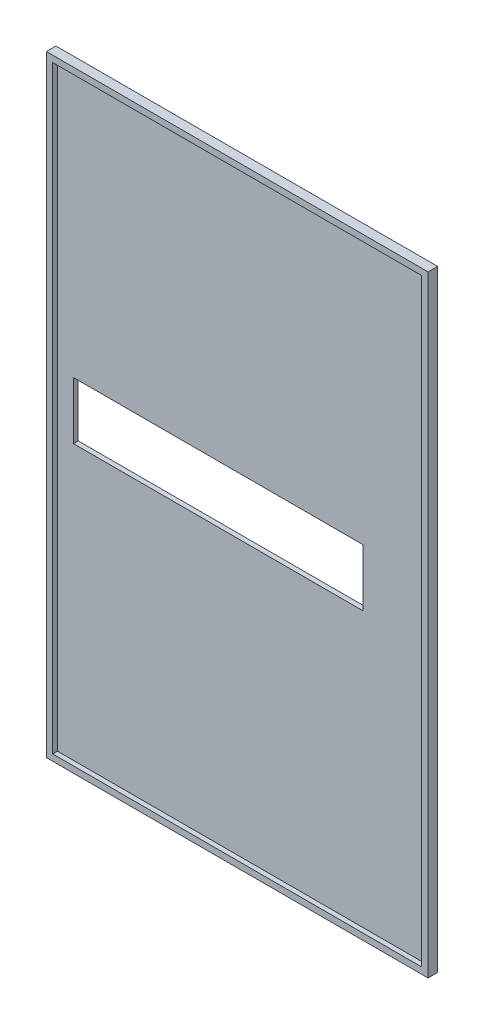
ISO-10303-21;
HEADER;
FILE_DESCRIPTION(('STEP AP214'),'2;1');
FILE_NAME('part.step','',(''),(''),'','','');
FILE_SCHEMA(('AUTOMOTIVE_DESIGN { 1 0 10303 214 1 1 1 1 }'));
ENDSEC;
DATA;
#1=APPLICATION_CONTEXT('core data for automotive mechanical design processes');
#2=APPLICATION_PROTOCOL_DEFINITION('international standard','automotive_design',2000,#1);
#3=PRODUCT_CONTEXT('',#1,'mechanical');
#4=PRODUCT('Part','Part','',(#3));
#5=PRODUCT_RELATED_PRODUCT_CATEGORY('part','',(#4));
#6=PRODUCT_DEFINITION_FORMATION('','',#4);
#7=PRODUCT_DEFINITION_CONTEXT('part definition',#1,'design');
#8=PRODUCT_DEFINITION('design','',#6,#7);
#9=PRODUCT_DEFINITION_SHAPE('','',#8);
#10=(LENGTH_UNIT() NAMED_UNIT(*) SI_UNIT(.MILLI.,.METRE.));
#11=(NAMED_UNIT(*) PLANE_ANGLE_UNIT() SI_UNIT($,.RADIAN.));
#12=(NAMED_UNIT(*) SI_UNIT($,.STERADIAN.) SOLID_ANGLE_UNIT());
#13=UNCERTAINTY_MEASURE_WITH_UNIT(LENGTH_MEASURE(1.E-05),#10,'distance_accuracy_value','');
#14=(GEOMETRIC_REPRESENTATION_CONTEXT(3) GLOBAL_UNCERTAINTY_ASSIGNED_CONTEXT((#13)) GLOBAL_UNIT_ASSIGNED_CONTEXT((#10,
#11,#12)) REPRESENTATION_CONTEXT('',''));
#15=CARTESIAN_POINT('',(0.,0.,0.));
#16=DIRECTION('',(0.,0.,1.));
#17=DIRECTION('',(1.,0.,0.));
#18=AXIS2_PLACEMENT_3D('',#15,#16,#17);
#19=CARTESIAN_POINT('',(0.,0.,3.));
#20=DIRECTION('',(1.,0.,0.));
#21=DIRECTION('',(0.,1.,0.));
#22=AXIS2_PLACEMENT_3D('',#19,#20,#21);
#23=PLANE('',#22);
#24=DIRECTION('',(0.,-1.,0.));
#25=VECTOR('',#24,1.);
#26=CARTESIAN_POINT('',(0.,0.,0.));
#27=LINE('',#26,#25);
#28=CARTESIAN_POINT('',(0.,0.,0.));
#29=VERTEX_POINT('',#28);
#30=CARTESIAN_POINT('',(0.,-192.24,0.));
#31=VERTEX_POINT('',#30);
#32=EDGE_CURVE('E211',#29,#31,#27,.T.);
#33=ORIENTED_EDGE('',*,*,#32,.T.);
#34=DIRECTION('',(0.,0.,-1.));
#35=VECTOR('',#34,1.);
#36=CARTESIAN_POINT('',(0.,-192.24,3.));
#37=LINE('',#36,#35);
#38=CARTESIAN_POINT('',(0.,-192.24,3.));
#39=VERTEX_POINT('',#38);
#40=EDGE_CURVE('E11',#39,#31,#37,.T.);
#41=ORIENTED_EDGE('',*,*,#40,.F.);
#42=DIRECTION('',(0.,-1.,0.));
#43=VECTOR('',#42,1.);
#44=CARTESIAN_POINT('',(0.,0.,3.));
#45=LINE('',#44,#43);
#46=CARTESIAN_POINT('',(0.,0.,3.));
#47=VERTEX_POINT('',#46);
#48=EDGE_CURVE('E221',#47,#39,#45,.T.);
#49=ORIENTED_EDGE('',*,*,#48,.F.);
#50=DIRECTION('',(0.,0.,-1.));
#51=VECTOR('',#50,1.);
#52=CARTESIAN_POINT('',(0.,0.,3.));
#53=LINE('',#52,#51);
#54=EDGE_CURVE('E235',#47,#29,#53,.T.);
#55=ORIENTED_EDGE('',*,*,#54,.T.);
#56=EDGE_LOOP('',(#33,#41,#49,#55));
#57=FACE_BOUND('',#56,.T.);
#58=ADVANCED_FACE('F39',(#57),#23,.F.);
#59=CARTESIAN_POINT('',(0.,-192.24,3.));
#60=DIRECTION('',(0.,1.,0.));
#61=DIRECTION('',(0.,0.,1.));
#62=AXIS2_PLACEMENT_3D('',#59,#60,#61);
#63=PLANE('',#62);
#64=DIRECTION('',(1.,0.,0.));
#65=VECTOR('',#64,1.);
#66=CARTESIAN_POINT('',(0.,-192.24,0.));
#67=LINE('',#66,#65);
#68=CARTESIAN_POINT('',(120.,-192.24,0.));
#69=VERTEX_POINT('',#68);
#70=EDGE_CURVE('E239',#31,#69,#67,.T.);
#71=ORIENTED_EDGE('',*,*,#70,.T.);
#72=DIRECTION('',(0.,0.,-1.));
#73=VECTOR('',#72,1.);
#74=CARTESIAN_POINT('',(120.,-192.24,3.));
#75=LINE('',#74,#73);
#76=CARTESIAN_POINT('',(120.,-192.24,3.));
#77=VERTEX_POINT('',#76);
#78=EDGE_CURVE('E47',#77,#69,#75,.T.);
#79=ORIENTED_EDGE('',*,*,#78,.F.);
#80=DIRECTION('',(1.,0.,0.));
#81=VECTOR('',#80,1.);
#82=CARTESIAN_POINT('',(0.,-192.24,3.));
#83=LINE('',#82,#81);
#84=EDGE_CURVE('E225',#39,#77,#83,.T.);
#85=ORIENTED_EDGE('',*,*,#84,.F.);
#86=ORIENTED_EDGE('',*,*,#40,.T.);
#87=EDGE_LOOP('',(#71,#79,#85,#86));
#88=FACE_BOUND('',#87,.T.);
#89=ADVANCED_FACE('F275',(#88),#63,.F.);
#90=CARTESIAN_POINT('',(120.,0.,3.));
#91=DIRECTION('',(-1.,0.,0.));
#92=DIRECTION('',(0.,-1.,0.));
#93=AXIS2_PLACEMENT_3D('',#90,#91,#92);
#94=PLANE('',#93);
#95=DIRECTION('',(0.,1.,0.));
#96=VECTOR('',#95,1.);
#97=CARTESIAN_POINT('',(120.,0.,0.));
#98=LINE('',#97,#96);
#99=CARTESIAN_POINT('',(120.,0.,0.));
#100=VERTEX_POINT('',#99);
#101=EDGE_CURVE('E242',#69,#100,#98,.T.);
#102=ORIENTED_EDGE('',*,*,#101,.T.);
#103=DIRECTION('',(0.,0.,-1.));
#104=VECTOR('',#103,1.);
#105=CARTESIAN_POINT('',(120.,0.,3.));
#106=LINE('',#105,#104);
#107=CARTESIAN_POINT('',(120.,0.,3.));
#108=VERTEX_POINT('',#107);
#109=EDGE_CURVE('E250',#108,#100,#106,.T.);
#110=ORIENTED_EDGE('',*,*,#109,.F.);
#111=DIRECTION('',(0.,1.,0.));
#112=VECTOR('',#111,1.);
#113=CARTESIAN_POINT('',(120.,0.,3.));
#114=LINE('',#113,#112);
#115=EDGE_CURVE('E229',#77,#108,#114,.T.);
#116=ORIENTED_EDGE('',*,*,#115,.F.);
#117=ORIENTED_EDGE('',*,*,#78,.T.);
#118=EDGE_LOOP('',(#102,#110,#116,#117));
#119=FACE_BOUND('',#118,.T.);
#120=ADVANCED_FACE('F259',(#119),#94,.F.);
#121=CARTESIAN_POINT('',(0.,0.,3.));
#122=DIRECTION('',(0.,-1.,0.));
#123=DIRECTION('',(0.,0.,-1.));
#124=AXIS2_PLACEMENT_3D('',#121,#122,#123);
#125=PLANE('',#124);
#126=DIRECTION('',(-1.,0.,0.));
#127=VECTOR('',#126,1.);
#128=CARTESIAN_POINT('',(0.,0.,0.));
#129=LINE('',#128,#127);
#130=EDGE_CURVE('E226',#100,#29,#129,.T.);
#131=ORIENTED_EDGE('',*,*,#130,.T.);
#132=ORIENTED_EDGE('',*,*,#54,.F.);
#133=DIRECTION('',(-1.,0.,0.));
#134=VECTOR('',#133,1.);
#135=CARTESIAN_POINT('',(0.,0.,3.));
#136=LINE('',#135,#134);
#137=EDGE_CURVE('E232',#108,#47,#136,.T.);
#138=ORIENTED_EDGE('',*,*,#137,.F.);
#139=ORIENTED_EDGE('',*,*,#109,.T.);
#140=EDGE_LOOP('',(#131,#132,#138,#139));
#141=FACE_BOUND('',#140,.T.);
#142=ADVANCED_FACE('F268',(#141),#125,.F.);
#143=CARTESIAN_POINT('',(0.,0.,3.));
#144=DIRECTION('',(0.,0.,1.));
#145=DIRECTION('',(1.,0.,0.));
#146=AXIS2_PLACEMENT_3D('',#143,#144,#145);
#147=PLANE('',#146);
#148=DIRECTION('',(0.,-1.,0.));
#149=VECTOR('',#148,1.);
#150=CARTESIAN_POINT('',(2.,-2.,3.));
#151=LINE('',#150,#149);
#152=CARTESIAN_POINT('',(2.,-2.,3.));
#153=VERTEX_POINT('',#152);
#154=CARTESIAN_POINT('',(2.00000000000002,-190.24,3.));
#155=VERTEX_POINT('',#154);
#156=EDGE_CURVE('E171',#153,#155,#151,.T.);
#157=ORIENTED_EDGE('',*,*,#156,.F.);
#158=DIRECTION('',(-1.,0.,0.));
#159=VECTOR('',#158,1.);
#160=CARTESIAN_POINT('',(2.,-2.,3.));
#161=LINE('',#160,#159);
#162=CARTESIAN_POINT('',(118.,-2.,3.));
#163=VERTEX_POINT('',#162);
#164=EDGE_CURVE('E182',#163,#153,#161,.T.);
#165=ORIENTED_EDGE('',*,*,#164,.F.);
#166=DIRECTION('',(0.,1.,0.));
#167=VECTOR('',#166,1.);
#168=CARTESIAN_POINT('',(118.,-2.,3.));
#169=LINE('',#168,#167);
#170=CARTESIAN_POINT('',(118.,-190.24,3.));
#171=VERTEX_POINT('',#170);
#172=EDGE_CURVE('E201',#171,#163,#169,.T.);
#173=ORIENTED_EDGE('',*,*,#172,.F.);
#174=DIRECTION('',(1.,0.,0.));
#175=VECTOR('',#174,1.);
#176=CARTESIAN_POINT('',(2.00000000000002,-190.24,3.));
#177=LINE('',#176,#175);
#178=EDGE_CURVE('E197',#155,#171,#177,.T.);
#179=ORIENTED_EDGE('',*,*,#178,.F.);
#180=EDGE_LOOP('',(#157,#165,#173,#179));
#181=FACE_BOUND('',#180,.T.);
#182=ORIENTED_EDGE('',*,*,#48,.T.);
#183=ORIENTED_EDGE('',*,*,#84,.T.);
#184=ORIENTED_EDGE('',*,*,#115,.T.);
#185=ORIENTED_EDGE('',*,*,#137,.T.);
#186=EDGE_LOOP('',(#182,#183,#184,#185));
#187=FACE_BOUND('',#186,.T.);
#188=ADVANCED_FACE('F274',(#181,#187),#147,.T.);
#189=CARTESIAN_POINT('',(0.,0.,0.));
#190=DIRECTION('',(0.,0.,1.));
#191=DIRECTION('',(1.,0.,0.));
#192=AXIS2_PLACEMENT_3D('',#189,#190,#191);
#193=PLANE('',#192);
#194=DIRECTION('',(-1.,0.,0.));
#195=VECTOR('',#194,1.);
#196=CARTESIAN_POINT('',(98.,-104.,0.));
#197=LINE('',#196,#195);
#198=CARTESIAN_POINT('',(98.,-104.,0.));
#199=VERTEX_POINT('',#198);
#200=CARTESIAN_POINT('',(7.00000000000001,-104.,0.));
#201=VERTEX_POINT('',#200);
#202=EDGE_CURVE('E162',#199,#201,#197,.T.);
#203=ORIENTED_EDGE('',*,*,#202,.F.);
#204=DIRECTION('',(0.,-1.,0.));
#205=VECTOR('',#204,1.);
#206=CARTESIAN_POINT('',(98.,-86.,0.));
#207=LINE('',#206,#205);
#208=CARTESIAN_POINT('',(98.,-86.,0.));
#209=VERTEX_POINT('',#208);
#210=EDGE_CURVE('E54',#209,#199,#207,.T.);
#211=ORIENTED_EDGE('',*,*,#210,.F.);
#212=DIRECTION('',(1.,0.,0.));
#213=VECTOR('',#212,1.);
#214=CARTESIAN_POINT('',(98.,-86.,0.));
#215=LINE('',#214,#213);
#216=CARTESIAN_POINT('',(7.00000000000001,-86.,0.));
#217=VERTEX_POINT('',#216);
#218=EDGE_CURVE('E149',#217,#209,#215,.T.);
#219=ORIENTED_EDGE('',*,*,#218,.F.);
#220=DIRECTION('',(0.,1.,0.));
#221=VECTOR('',#220,1.);
#222=CARTESIAN_POINT('',(7.00000000000001,-86.,0.));
#223=LINE('',#222,#221);
#224=EDGE_CURVE('E153',#201,#217,#223,.T.);
#225=ORIENTED_EDGE('',*,*,#224,.F.);
#226=EDGE_LOOP('',(#203,#211,#219,#225));
#227=FACE_BOUND('',#226,.T.);
#228=ORIENTED_EDGE('',*,*,#32,.F.);
#229=ORIENTED_EDGE('',*,*,#130,.F.);
#230=ORIENTED_EDGE('',*,*,#101,.F.);
#231=ORIENTED_EDGE('',*,*,#70,.F.);
#232=EDGE_LOOP('',(#228,#229,#230,#231));
#233=FACE_BOUND('',#232,.T.);
#234=ADVANCED_FACE('F265',(#227,#233),#193,.F.);
#235=CARTESIAN_POINT('',(2.,-2.,1.5));
#236=DIRECTION('',(-1.,0.,0.));
#237=DIRECTION('',(0.,-1.,0.));
#238=AXIS2_PLACEMENT_3D('',#235,#236,#237);
#239=PLANE('',#238);
#240=ORIENTED_EDGE('',*,*,#156,.T.);
#241=DIRECTION('',(0.,0.,1.));
#242=VECTOR('',#241,1.);
#243=CARTESIAN_POINT('',(2.00000000000002,-190.24,1.5));
#244=LINE('',#243,#242);
#245=CARTESIAN_POINT('',(2.00000000000002,-190.24,1.5));
#246=VERTEX_POINT('',#245);
#247=EDGE_CURVE('E194',#246,#155,#244,.T.);
#248=ORIENTED_EDGE('',*,*,#247,.F.);
#249=DIRECTION('',(0.,-1.,0.));
#250=VECTOR('',#249,1.);
#251=CARTESIAN_POINT('',(2.,-2.,1.5));
#252=LINE('',#251,#250);
#253=CARTESIAN_POINT('',(2.,-2.,1.5));
#254=VERTEX_POINT('',#253);
#255=EDGE_CURVE('E177',#254,#246,#252,.T.);
#256=ORIENTED_EDGE('',*,*,#255,.F.);
#257=DIRECTION('',(0.,0.,1.));
#258=VECTOR('',#257,1.);
#259=CARTESIAN_POINT('',(2.,-2.,1.5));
#260=LINE('',#259,#258);
#261=EDGE_CURVE('E208',#254,#153,#260,.T.);
#262=ORIENTED_EDGE('',*,*,#261,.T.);
#263=EDGE_LOOP('',(#240,#248,#256,#262));
#264=FACE_BOUND('',#263,.T.);
#265=ADVANCED_FACE('F287',(#264),#239,.F.);
#266=CARTESIAN_POINT('',(2.,-2.,1.5));
#267=DIRECTION('',(0.,1.,0.));
#268=DIRECTION('',(0.,0.,1.));
#269=AXIS2_PLACEMENT_3D('',#266,#267,#268);
#270=PLANE('',#269);
#271=ORIENTED_EDGE('',*,*,#164,.T.);
#272=ORIENTED_EDGE('',*,*,#261,.F.);
#273=DIRECTION('',(-1.,0.,0.));
#274=VECTOR('',#273,1.);
#275=CARTESIAN_POINT('',(2.,-2.,1.5));
#276=LINE('',#275,#274);
#277=CARTESIAN_POINT('',(118.,-2.,1.5));
#278=VERTEX_POINT('',#277);
#279=EDGE_CURVE('E190',#278,#254,#276,.T.);
#280=ORIENTED_EDGE('',*,*,#279,.F.);
#281=DIRECTION('',(0.,0.,1.));
#282=VECTOR('',#281,1.);
#283=CARTESIAN_POINT('',(118.,-2.,1.5));
#284=LINE('',#283,#282);
#285=EDGE_CURVE('E212',#278,#163,#284,.T.);
#286=ORIENTED_EDGE('',*,*,#285,.T.);
#287=EDGE_LOOP('',(#271,#272,#280,#286));
#288=FACE_BOUND('',#287,.T.);
#289=ADVANCED_FACE('F294',(#288),#270,.F.);
#290=CARTESIAN_POINT('',(118.,-2.,1.5));
#291=DIRECTION('',(1.,0.,0.));
#292=DIRECTION('',(0.,1.,0.));
#293=AXIS2_PLACEMENT_3D('',#290,#291,#292);
#294=PLANE('',#293);
#295=ORIENTED_EDGE('',*,*,#172,.T.);
#296=ORIENTED_EDGE('',*,*,#285,.F.);
#297=DIRECTION('',(0.,1.,0.));
#298=VECTOR('',#297,1.);
#299=CARTESIAN_POINT('',(118.,-2.,1.5));
#300=LINE('',#299,#298);
#301=CARTESIAN_POINT('',(118.,-190.24,1.5));
#302=VERTEX_POINT('',#301);
#303=EDGE_CURVE('E186',#302,#278,#300,.T.);
#304=ORIENTED_EDGE('',*,*,#303,.F.);
#305=DIRECTION('',(0.,0.,1.));
#306=VECTOR('',#305,1.);
#307=CARTESIAN_POINT('',(118.,-190.24,1.5));
#308=LINE('',#307,#306);
#309=EDGE_CURVE('E215',#302,#171,#308,.T.);
#310=ORIENTED_EDGE('',*,*,#309,.T.);
#311=EDGE_LOOP('',(#295,#296,#304,#310));
#312=FACE_BOUND('',#311,.T.);
#313=ADVANCED_FACE('F299',(#312),#294,.F.);
#314=CARTESIAN_POINT('',(2.00000000000002,-190.24,1.5));
#315=DIRECTION('',(0.,-1.,0.));
#316=DIRECTION('',(0.,0.,-1.));
#317=AXIS2_PLACEMENT_3D('',#314,#315,#316);
#318=PLANE('',#317);
#319=ORIENTED_EDGE('',*,*,#178,.T.);
#320=ORIENTED_EDGE('',*,*,#309,.F.);
#321=DIRECTION('',(1.,0.,0.));
#322=VECTOR('',#321,1.);
#323=CARTESIAN_POINT('',(2.00000000000002,-190.24,1.5));
#324=LINE('',#323,#322);
#325=EDGE_CURVE('E181',#246,#302,#324,.T.);
#326=ORIENTED_EDGE('',*,*,#325,.F.);
#327=ORIENTED_EDGE('',*,*,#247,.T.);
#328=EDGE_LOOP('',(#319,#320,#326,#327));
#329=FACE_BOUND('',#328,.T.);
#330=ADVANCED_FACE('F296',(#329),#318,.F.);
#331=CARTESIAN_POINT('',(0.,0.,1.5));
#332=DIRECTION('',(0.,0.,1.));
#333=DIRECTION('',(1.,0.,0.));
#334=AXIS2_PLACEMENT_3D('',#331,#332,#333);
#335=PLANE('',#334);
#336=DIRECTION('',(0.,-1.,0.));
#337=VECTOR('',#336,1.);
#338=CARTESIAN_POINT('',(98.,-86.,1.5));
#339=LINE('',#338,#337);
#340=CARTESIAN_POINT('',(98.,-86.,1.5));
#341=VERTEX_POINT('',#340);
#342=CARTESIAN_POINT('',(98.,-104.,1.5));
#343=VERTEX_POINT('',#342);
#344=EDGE_CURVE('E130',#341,#343,#339,.T.);
#345=ORIENTED_EDGE('',*,*,#344,.T.);
#346=DIRECTION('',(-1.,0.,0.));
#347=VECTOR('',#346,1.);
#348=CARTESIAN_POINT('',(98.,-104.,1.5));
#349=LINE('',#348,#347);
#350=CARTESIAN_POINT('',(7.00000000000001,-104.,1.5));
#351=VERTEX_POINT('',#350);
#352=EDGE_CURVE('E140',#343,#351,#349,.T.);
#353=ORIENTED_EDGE('',*,*,#352,.T.);
#354=DIRECTION('',(0.,1.,0.));
#355=VECTOR('',#354,1.);
#356=CARTESIAN_POINT('',(7.00000000000001,-86.,1.5));
#357=LINE('',#356,#355);
#358=CARTESIAN_POINT('',(7.00000000000001,-86.,1.5));
#359=VERTEX_POINT('',#358);
#360=EDGE_CURVE('E62',#351,#359,#357,.T.);
#361=ORIENTED_EDGE('',*,*,#360,.T.);
#362=DIRECTION('',(1.,0.,0.));
#363=VECTOR('',#362,1.);
#364=CARTESIAN_POINT('',(98.,-86.,1.5));
#365=LINE('',#364,#363);
#366=EDGE_CURVE('E137',#359,#341,#365,.T.);
#367=ORIENTED_EDGE('',*,*,#366,.T.);
#368=EDGE_LOOP('',(#345,#353,#361,#367));
#369=FACE_BOUND('',#368,.T.);
#370=ORIENTED_EDGE('',*,*,#255,.T.);
#371=ORIENTED_EDGE('',*,*,#325,.T.);
#372=ORIENTED_EDGE('',*,*,#303,.T.);
#373=ORIENTED_EDGE('',*,*,#279,.T.);
#374=EDGE_LOOP('',(#370,#371,#372,#373));
#375=FACE_BOUND('',#374,.T.);
#376=ADVANCED_FACE('F145',(#369,#375),#335,.T.);
#377=CARTESIAN_POINT('',(98.,-86.,1.5));
#378=DIRECTION('',(1.,0.,0.));
#379=DIRECTION('',(0.,0.,-1.));
#380=AXIS2_PLACEMENT_3D('',#377,#378,#379);
#381=PLANE('',#380);
#382=ORIENTED_EDGE('',*,*,#210,.T.);
#383=DIRECTION('',(0.,0.,-1.));
#384=VECTOR('',#383,1.);
#385=CARTESIAN_POINT('',(98.,-104.,1.5));
#386=LINE('',#385,#384);
#387=EDGE_CURVE('E126',#343,#199,#386,.T.);
#388=ORIENTED_EDGE('',*,*,#387,.F.);
#389=ORIENTED_EDGE('',*,*,#344,.F.);
#390=DIRECTION('',(0.,0.,-1.));
#391=VECTOR('',#390,1.);
#392=CARTESIAN_POINT('',(98.,-86.,1.5));
#393=LINE('',#392,#391);
#394=EDGE_CURVE('E168',#341,#209,#393,.T.);
#395=ORIENTED_EDGE('',*,*,#394,.T.);
#396=EDGE_LOOP('',(#382,#388,#389,#395));
#397=FACE_BOUND('',#396,.T.);
#398=ADVANCED_FACE('F128',(#397),#381,.F.);
#399=CARTESIAN_POINT('',(98.,-86.,1.5));
#400=DIRECTION('',(0.,1.,0.));
#401=DIRECTION('',(0.,0.,1.));
#402=AXIS2_PLACEMENT_3D('',#399,#400,#401);
#403=PLANE('',#402);
#404=ORIENTED_EDGE('',*,*,#218,.T.);
#405=ORIENTED_EDGE('',*,*,#394,.F.);
#406=ORIENTED_EDGE('',*,*,#366,.F.);
#407=DIRECTION('',(0.,0.,-1.));
#408=VECTOR('',#407,1.);
#409=CARTESIAN_POINT('',(7.00000000000001,-86.,1.5));
#410=LINE('',#409,#408);
#411=EDGE_CURVE('E172',#359,#217,#410,.T.);
#412=ORIENTED_EDGE('',*,*,#411,.T.);
#413=EDGE_LOOP('',(#404,#405,#406,#412));
#414=FACE_BOUND('',#413,.T.);
#415=ADVANCED_FACE('F311',(#414),#403,.F.);
#416=CARTESIAN_POINT('',(7.00000000000001,-86.,1.5));
#417=DIRECTION('',(-1.,0.,0.));
#418=DIRECTION('',(0.,0.,1.));
#419=AXIS2_PLACEMENT_3D('',#416,#417,#418);
#420=PLANE('',#419);
#421=ORIENTED_EDGE('',*,*,#224,.T.);
#422=ORIENTED_EDGE('',*,*,#411,.F.);
#423=ORIENTED_EDGE('',*,*,#360,.F.);
#424=DIRECTION('',(0.,0.,-1.));
#425=VECTOR('',#424,1.);
#426=CARTESIAN_POINT('',(7.00000000000001,-104.,1.5));
#427=LINE('',#426,#425);
#428=EDGE_CURVE('E136',#351,#201,#427,.T.);
#429=ORIENTED_EDGE('',*,*,#428,.T.);
#430=EDGE_LOOP('',(#421,#422,#423,#429));
#431=FACE_BOUND('',#430,.T.);
#432=ADVANCED_FACE('F314',(#431),#420,.F.);
#433=CARTESIAN_POINT('',(98.,-104.,1.5));
#434=DIRECTION('',(0.,-1.,0.));
#435=DIRECTION('',(0.,0.,-1.));
#436=AXIS2_PLACEMENT_3D('',#433,#434,#435);
#437=PLANE('',#436);
#438=ORIENTED_EDGE('',*,*,#202,.T.);
#439=ORIENTED_EDGE('',*,*,#428,.F.);
#440=ORIENTED_EDGE('',*,*,#352,.F.);
#441=ORIENTED_EDGE('',*,*,#387,.T.);
#442=EDGE_LOOP('',(#438,#439,#440,#441));
#443=FACE_BOUND('',#442,.T.);
#444=ADVANCED_FACE('F141',(#443),#437,.F.);
#445=CLOSED_SHELL('',(#58,#89,#120,#142,#188,#234,#265,#289,#313,#330,#376,#398,#415,#432,#444));
#446=MANIFOLD_SOLID_BREP('B2',#445);
#447=ADVANCED_BREP_SHAPE_REPRESENTATION('',(#18,#446),#14);
#448=SHAPE_DEFINITION_REPRESENTATION(#9,#447);
ENDSEC;
END-ISO-10303-21;
